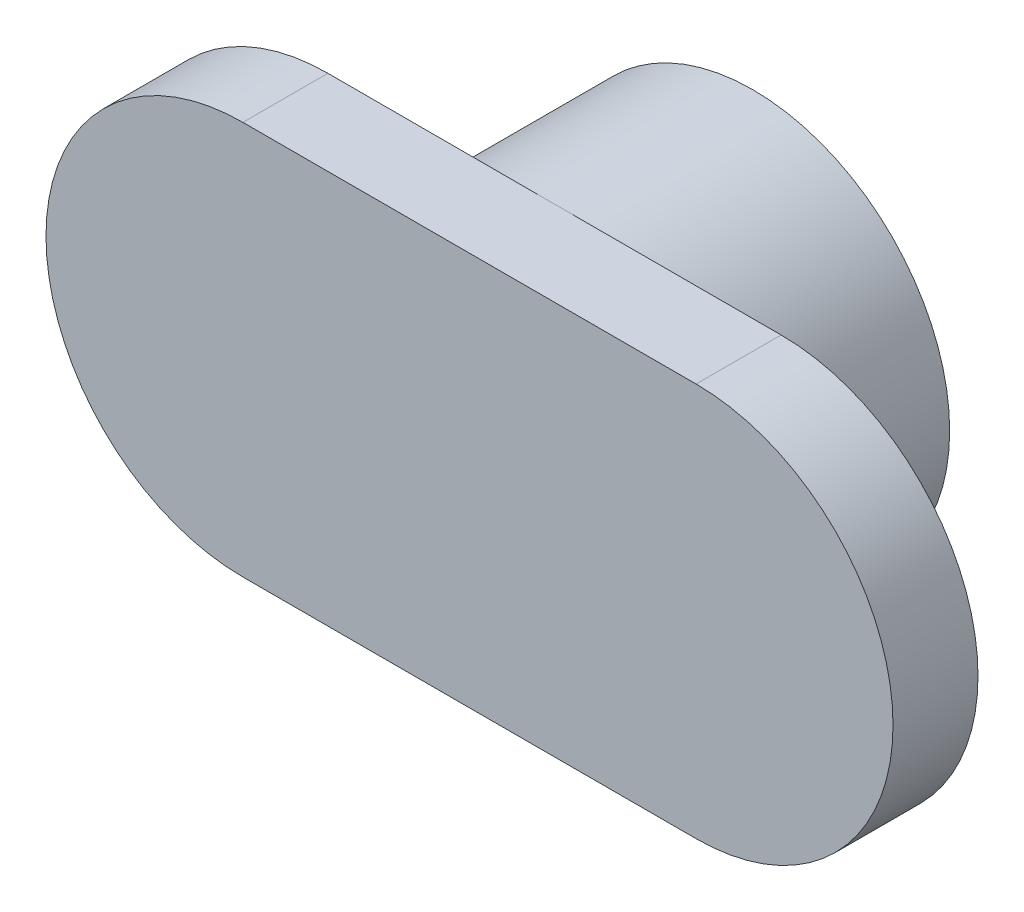
ISO-10303-21;
HEADER;
FILE_DESCRIPTION(('STEP AP214'),'2;1');
FILE_NAME('part.step','',(''),(''),'','','');
FILE_SCHEMA(('AUTOMOTIVE_DESIGN { 1 0 10303 214 1 1 1 1 }'));
ENDSEC;
DATA;
#1=APPLICATION_CONTEXT('core data for automotive mechanical design processes');
#2=APPLICATION_PROTOCOL_DEFINITION('international standard','automotive_design',2000,#1);
#3=PRODUCT_CONTEXT('',#1,'mechanical');
#4=PRODUCT('Part','Part','',(#3));
#5=PRODUCT_RELATED_PRODUCT_CATEGORY('part','',(#4));
#6=PRODUCT_DEFINITION_FORMATION('','',#4);
#7=PRODUCT_DEFINITION_CONTEXT('part definition',#1,'design');
#8=PRODUCT_DEFINITION('design','',#6,#7);
#9=PRODUCT_DEFINITION_SHAPE('','',#8);
#10=(LENGTH_UNIT() NAMED_UNIT(*) SI_UNIT(.MILLI.,.METRE.));
#11=(NAMED_UNIT(*) PLANE_ANGLE_UNIT() SI_UNIT($,.RADIAN.));
#12=(NAMED_UNIT(*) SI_UNIT($,.STERADIAN.) SOLID_ANGLE_UNIT());
#13=UNCERTAINTY_MEASURE_WITH_UNIT(LENGTH_MEASURE(1.E-05),#10,'distance_accuracy_value','');
#14=(GEOMETRIC_REPRESENTATION_CONTEXT(3) GLOBAL_UNCERTAINTY_ASSIGNED_CONTEXT((#13)) GLOBAL_UNIT_ASSIGNED_CONTEXT((#10,
#11,#12)) REPRESENTATION_CONTEXT('',''));
#15=CARTESIAN_POINT('',(0.,0.,0.));
#16=DIRECTION('',(0.,0.,1.));
#17=DIRECTION('',(1.,0.,0.));
#18=AXIS2_PLACEMENT_3D('',#15,#16,#17);
#19=CARTESIAN_POINT('',(0.,0.,3.5));
#20=DIRECTION('',(0.,0.,-1.));
#21=DIRECTION('',(-1.,0.,0.));
#22=AXIS2_PLACEMENT_3D('',#19,#20,#21);
#23=CYLINDRICAL_SURFACE('',#22,3.475);
#24=CARTESIAN_POINT('',(0.,0.,3.5));
#25=DIRECTION('',(0.,0.,1.));
#26=DIRECTION('',(1.,0.,0.));
#27=AXIS2_PLACEMENT_3D('',#24,#25,#26);
#28=CIRCLE('',#27,3.475);
#29=CARTESIAN_POINT('',(0.,3.475,3.5));
#30=VERTEX_POINT('',#29);
#31=CARTESIAN_POINT('',(0.,-3.475,3.5));
#32=VERTEX_POINT('',#31);
#33=EDGE_CURVE('E11',#30,#32,#28,.T.);
#34=ORIENTED_EDGE('',*,*,#33,.F.);
#35=EDGE_CURVE('E41',#32,#30,#28,.T.);
#36=ORIENTED_EDGE('',*,*,#35,.F.);
#37=EDGE_LOOP('',(#34,#36));
#38=FACE_BOUND('',#37,.T.);
#39=CARTESIAN_POINT('',(0.,0.,0.));
#40=DIRECTION('',(0.,0.,1.));
#41=DIRECTION('',(1.,0.,0.));
#42=AXIS2_PLACEMENT_3D('',#39,#40,#41);
#43=CIRCLE('',#42,3.475);
#44=CARTESIAN_POINT('',(3.475,0.,0.));
#45=VERTEX_POINT('',#44);
#46=EDGE_CURVE('E36',#45,#45,#43,.T.);
#47=ORIENTED_EDGE('',*,*,#46,.T.);
#48=EDGE_LOOP('',(#47));
#49=FACE_BOUND('',#48,.T.);
#50=ADVANCED_FACE('F33',(#38,#49),#23,.T.);
#51=CARTESIAN_POINT('',(0.,0.,0.));
#52=DIRECTION('',(0.,0.,1.));
#53=DIRECTION('',(1.,0.,0.));
#54=AXIS2_PLACEMENT_3D('',#51,#52,#53);
#55=PLANE('',#54);
#56=ORIENTED_EDGE('',*,*,#46,.F.);
#57=EDGE_LOOP('',(#56));
#58=FACE_BOUND('',#57,.T.);
#59=ADVANCED_FACE('F139',(#58),#55,.F.);
#60=CARTESIAN_POINT('',(-4.,0.,3.5));
#61=DIRECTION('',(0.,0.,1.));
#62=DIRECTION('',(1.,0.,0.));
#63=AXIS2_PLACEMENT_3D('',#60,#61,#62);
#64=PLANE('',#63);
#65=DIRECTION('',(-1.,0.,0.));
#66=VECTOR('',#65,1.);
#67=CARTESIAN_POINT('',(-4.,3.475,3.5));
#68=LINE('',#67,#66);
#69=CARTESIAN_POINT('',(-4.,3.475,3.5));
#70=VERTEX_POINT('',#69);
#71=EDGE_CURVE('E111',#30,#70,#68,.T.);
#72=ORIENTED_EDGE('',*,*,#71,.F.);
#73=ORIENTED_EDGE('',*,*,#33,.T.);
#74=DIRECTION('',(1.,0.,0.));
#75=VECTOR('',#74,1.);
#76=CARTESIAN_POINT('',(-4.,-3.475,3.5));
#77=LINE('',#76,#75);
#78=CARTESIAN_POINT('',(-4.,-3.475,3.5));
#79=VERTEX_POINT('',#78);
#80=EDGE_CURVE('E114',#79,#32,#77,.T.);
#81=ORIENTED_EDGE('',*,*,#80,.F.);
#82=CARTESIAN_POINT('',(-4.,0.,3.5));
#83=DIRECTION('',(0.,0.,1.));
#84=DIRECTION('',(1.,0.,0.));
#85=AXIS2_PLACEMENT_3D('',#82,#83,#84);
#86=CIRCLE('',#85,3.475);
#87=EDGE_CURVE('E99',#70,#79,#86,.T.);
#88=ORIENTED_EDGE('',*,*,#87,.F.);
#89=EDGE_LOOP('',(#72,#73,#81,#88));
#90=FACE_BOUND('',#89,.T.);
#91=ADVANCED_FACE('F128',(#90),#64,.F.);
#92=CARTESIAN_POINT('',(4.,-3.475,3.5));
#93=VERTEX_POINT('',#92);
#94=EDGE_CURVE('E116',#32,#93,#77,.T.);
#95=ORIENTED_EDGE('',*,*,#94,.F.);
#96=ORIENTED_EDGE('',*,*,#35,.T.);
#97=CARTESIAN_POINT('',(4.,3.475,3.5));
#98=VERTEX_POINT('',#97);
#99=EDGE_CURVE('E95',#98,#30,#68,.T.);
#100=ORIENTED_EDGE('',*,*,#99,.F.);
#101=CARTESIAN_POINT('',(4.,0.,3.5));
#102=DIRECTION('',(0.,0.,1.));
#103=DIRECTION('',(1.,0.,0.));
#104=AXIS2_PLACEMENT_3D('',#101,#102,#103);
#105=CIRCLE('',#104,3.475);
#106=EDGE_CURVE('E112',#93,#98,#105,.T.);
#107=ORIENTED_EDGE('',*,*,#106,.F.);
#108=EDGE_LOOP('',(#95,#96,#100,#107));
#109=FACE_BOUND('',#108,.T.);
#110=ADVANCED_FACE('F131',(#109),#64,.F.);
#111=CARTESIAN_POINT('',(-4.,0.,5.));
#112=DIRECTION('',(0.,0.,-1.));
#113=DIRECTION('',(-1.,0.,0.));
#114=AXIS2_PLACEMENT_3D('',#111,#112,#113);
#115=CYLINDRICAL_SURFACE('',#114,3.475);
#116=ORIENTED_EDGE('',*,*,#87,.T.);
#117=DIRECTION('',(0.,0.,-1.));
#118=VECTOR('',#117,1.);
#119=CARTESIAN_POINT('',(-4.,-3.475,5.));
#120=LINE('',#119,#118);
#121=CARTESIAN_POINT('',(-4.,-3.475,5.));
#122=VERTEX_POINT('',#121);
#123=EDGE_CURVE('E79',#122,#79,#120,.T.);
#124=ORIENTED_EDGE('',*,*,#123,.F.);
#125=CARTESIAN_POINT('',(-4.,0.,5.));
#126=DIRECTION('',(0.,0.,1.));
#127=DIRECTION('',(1.,0.,0.));
#128=AXIS2_PLACEMENT_3D('',#125,#126,#127);
#129=CIRCLE('',#128,3.475);
#130=CARTESIAN_POINT('',(-4.,3.475,5.));
#131=VERTEX_POINT('',#130);
#132=EDGE_CURVE('E86',#131,#122,#129,.T.);
#133=ORIENTED_EDGE('',*,*,#132,.F.);
#134=DIRECTION('',(0.,0.,-1.));
#135=VECTOR('',#134,1.);
#136=CARTESIAN_POINT('',(-4.,3.475,5.));
#137=LINE('',#136,#135);
#138=EDGE_CURVE('E107',#131,#70,#137,.T.);
#139=ORIENTED_EDGE('',*,*,#138,.T.);
#140=EDGE_LOOP('',(#116,#124,#133,#139));
#141=FACE_BOUND('',#140,.T.);
#142=ADVANCED_FACE('F97',(#141),#115,.T.);
#143=CARTESIAN_POINT('',(-4.,-3.475,5.));
#144=DIRECTION('',(0.,1.,0.));
#145=DIRECTION('',(-1.,0.,0.));
#146=AXIS2_PLACEMENT_3D('',#143,#144,#145);
#147=PLANE('',#146);
#148=ORIENTED_EDGE('',*,*,#80,.T.);
#149=ORIENTED_EDGE('',*,*,#94,.T.);
#150=DIRECTION('',(0.,0.,-1.));
#151=VECTOR('',#150,1.);
#152=CARTESIAN_POINT('',(4.,-3.475,5.));
#153=LINE('',#152,#151);
#154=CARTESIAN_POINT('',(4.,-3.475,5.));
#155=VERTEX_POINT('',#154);
#156=EDGE_CURVE('E82',#155,#93,#153,.T.);
#157=ORIENTED_EDGE('',*,*,#156,.F.);
#158=DIRECTION('',(1.,0.,0.));
#159=VECTOR('',#158,1.);
#160=CARTESIAN_POINT('',(-4.,-3.475,5.));
#161=LINE('',#160,#159);
#162=EDGE_CURVE('E74',#122,#155,#161,.T.);
#163=ORIENTED_EDGE('',*,*,#162,.F.);
#164=ORIENTED_EDGE('',*,*,#123,.T.);
#165=EDGE_LOOP('',(#148,#149,#157,#163,#164));
#166=FACE_BOUND('',#165,.T.);
#167=ADVANCED_FACE('F77',(#166),#147,.F.);
#168=CARTESIAN_POINT('',(4.,0.,5.));
#169=DIRECTION('',(0.,0.,-1.));
#170=DIRECTION('',(-1.,0.,0.));
#171=AXIS2_PLACEMENT_3D('',#168,#169,#170);
#172=CYLINDRICAL_SURFACE('',#171,3.475);
#173=ORIENTED_EDGE('',*,*,#106,.T.);
#174=DIRECTION('',(0.,0.,-1.));
#175=VECTOR('',#174,1.);
#176=CARTESIAN_POINT('',(4.,3.475,5.));
#177=LINE('',#176,#175);
#178=CARTESIAN_POINT('',(4.,3.475,5.));
#179=VERTEX_POINT('',#178);
#180=EDGE_CURVE('E102',#179,#98,#177,.T.);
#181=ORIENTED_EDGE('',*,*,#180,.F.);
#182=CARTESIAN_POINT('',(4.,0.,5.));
#183=DIRECTION('',(0.,0.,1.));
#184=DIRECTION('',(1.,0.,0.));
#185=AXIS2_PLACEMENT_3D('',#182,#183,#184);
#186=CIRCLE('',#185,3.475);
#187=EDGE_CURVE('E85',#155,#179,#186,.T.);
#188=ORIENTED_EDGE('',*,*,#187,.F.);
#189=ORIENTED_EDGE('',*,*,#156,.T.);
#190=EDGE_LOOP('',(#173,#181,#188,#189));
#191=FACE_BOUND('',#190,.T.);
#192=ADVANCED_FACE('F121',(#191),#172,.T.);
#193=CARTESIAN_POINT('',(-4.,3.475,5.));
#194=DIRECTION('',(0.,-1.,0.));
#195=DIRECTION('',(1.,0.,0.));
#196=AXIS2_PLACEMENT_3D('',#193,#194,#195);
#197=PLANE('',#196);
#198=ORIENTED_EDGE('',*,*,#99,.T.);
#199=ORIENTED_EDGE('',*,*,#71,.T.);
#200=ORIENTED_EDGE('',*,*,#138,.F.);
#201=DIRECTION('',(-1.,0.,0.));
#202=VECTOR('',#201,1.);
#203=CARTESIAN_POINT('',(-4.,3.475,5.));
#204=LINE('',#203,#202);
#205=EDGE_CURVE('E91',#179,#131,#204,.T.);
#206=ORIENTED_EDGE('',*,*,#205,.F.);
#207=ORIENTED_EDGE('',*,*,#180,.T.);
#208=EDGE_LOOP('',(#198,#199,#200,#206,#207));
#209=FACE_BOUND('',#208,.T.);
#210=ADVANCED_FACE('F125',(#209),#197,.F.);
#211=CARTESIAN_POINT('',(-4.,0.,5.));
#212=DIRECTION('',(0.,0.,1.));
#213=DIRECTION('',(1.,0.,0.));
#214=AXIS2_PLACEMENT_3D('',#211,#212,#213);
#215=PLANE('',#214);
#216=ORIENTED_EDGE('',*,*,#132,.T.);
#217=ORIENTED_EDGE('',*,*,#162,.T.);
#218=ORIENTED_EDGE('',*,*,#187,.T.);
#219=ORIENTED_EDGE('',*,*,#205,.T.);
#220=EDGE_LOOP('',(#216,#217,#218,#219));
#221=FACE_BOUND('',#220,.T.);
#222=ADVANCED_FACE('F89',(#221),#215,.T.);
#223=CLOSED_SHELL('',(#50,#59,#91,#110,#142,#167,#192,#210,#222));
#224=MANIFOLD_SOLID_BREP('B2',#223);
#225=ADVANCED_BREP_SHAPE_REPRESENTATION('',(#18,#224),#14);
#226=SHAPE_DEFINITION_REPRESENTATION(#9,#225);
ENDSEC;
END-ISO-10303-21;
